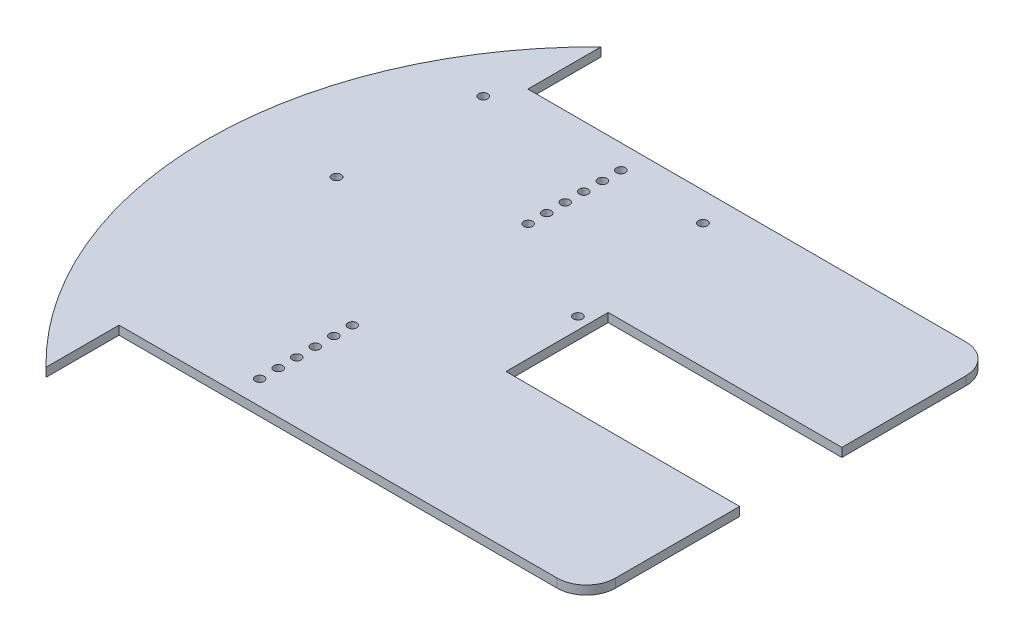
ISO-10303-21;
HEADER;
FILE_DESCRIPTION(('STEP AP214'),'2;1');
FILE_NAME('part.step','',(''),(''),'','','');
FILE_SCHEMA(('AUTOMOTIVE_DESIGN { 1 0 10303 214 1 1 1 1 }'));
ENDSEC;
DATA;
#1=APPLICATION_CONTEXT('core data for automotive mechanical design processes');
#2=APPLICATION_PROTOCOL_DEFINITION('international standard','automotive_design',2000,#1);
#3=PRODUCT_CONTEXT('',#1,'mechanical');
#4=PRODUCT('Part','Part','',(#3));
#5=PRODUCT_RELATED_PRODUCT_CATEGORY('part','',(#4));
#6=PRODUCT_DEFINITION_FORMATION('','',#4);
#7=PRODUCT_DEFINITION_CONTEXT('part definition',#1,'design');
#8=PRODUCT_DEFINITION('design','',#6,#7);
#9=PRODUCT_DEFINITION_SHAPE('','',#8);
#10=(LENGTH_UNIT() NAMED_UNIT(*) SI_UNIT(.MILLI.,.METRE.));
#11=(NAMED_UNIT(*) PLANE_ANGLE_UNIT() SI_UNIT($,.RADIAN.));
#12=(NAMED_UNIT(*) SI_UNIT($,.STERADIAN.) SOLID_ANGLE_UNIT());
#13=UNCERTAINTY_MEASURE_WITH_UNIT(LENGTH_MEASURE(1.E-05),#10,'distance_accuracy_value','');
#14=(GEOMETRIC_REPRESENTATION_CONTEXT(3) GLOBAL_UNCERTAINTY_ASSIGNED_CONTEXT((#13)) GLOBAL_UNIT_ASSIGNED_CONTEXT((#10,
#11,#12)) REPRESENTATION_CONTEXT('',''));
#15=CARTESIAN_POINT('',(0.,0.,0.));
#16=DIRECTION('',(0.,0.,1.));
#17=DIRECTION('',(1.,0.,0.));
#18=AXIS2_PLACEMENT_3D('',#15,#16,#17);
#19=CARTESIAN_POINT('',(200.301843205436,0.,-35.));
#20=DIRECTION('',(1.,0.,0.));
#21=DIRECTION('',(0.,0.,-1.));
#22=AXIS2_PLACEMENT_3D('',#19,#20,#21);
#23=PLANE('',#22);
#24=DIRECTION('',(0.,1.,0.));
#25=VECTOR('',#24,1.);
#26=CARTESIAN_POINT('',(200.301843205436,-2.,-112.5));
#27=LINE('',#26,#25);
#28=CARTESIAN_POINT('',(200.301843205436,0.,-112.5));
#29=VERTEX_POINT('',#28);
#30=CARTESIAN_POINT('',(200.301843205436,3.,-112.5));
#31=VERTEX_POINT('',#30);
#32=EDGE_CURVE('E491',#29,#31,#27,.T.);
#33=ORIENTED_EDGE('',*,*,#32,.F.);
#34=DIRECTION('',(0.,0.,-1.));
#35=VECTOR('',#34,1.);
#36=CARTESIAN_POINT('',(200.301843205436,0.,-35.));
#37=LINE('',#36,#35);
#38=CARTESIAN_POINT('',(200.301843205436,0.,-155.));
#39=VERTEX_POINT('',#38);
#40=EDGE_CURVE('E576',#29,#39,#37,.T.);
#41=ORIENTED_EDGE('',*,*,#40,.T.);
#42=DIRECTION('',(0.,1.,0.));
#43=VECTOR('',#42,1.);
#44=CARTESIAN_POINT('',(200.301843205436,0.,-155.));
#45=LINE('',#44,#43);
#46=CARTESIAN_POINT('',(200.301843205436,3.,-155.));
#47=VERTEX_POINT('',#46);
#48=EDGE_CURVE('E178',#39,#47,#45,.T.);
#49=ORIENTED_EDGE('',*,*,#48,.T.);
#50=DIRECTION('',(0.,0.,-1.));
#51=VECTOR('',#50,1.);
#52=CARTESIAN_POINT('',(200.301843205436,3.,-35.));
#53=LINE('',#52,#51);
#54=EDGE_CURVE('E152',#31,#47,#53,.T.);
#55=ORIENTED_EDGE('',*,*,#54,.F.);
#56=EDGE_LOOP('',(#33,#41,#49,#55));
#57=FACE_BOUND('',#56,.T.);
#58=ADVANCED_FACE('F38',(#57),#23,.T.);
#59=CARTESIAN_POINT('',(190.301843205435,0.,-35.));
#60=DIRECTION('',(0.,1.,0.));
#61=DIRECTION('',(0.,0.,1.));
#62=AXIS2_PLACEMENT_3D('',#59,#60,#61);
#63=CYLINDRICAL_SURFACE('',#62,10.);
#64=CARTESIAN_POINT('',(190.301843205435,3.,-35.));
#65=DIRECTION('',(0.,1.,0.));
#66=DIRECTION('',(0.,0.,1.));
#67=AXIS2_PLACEMENT_3D('',#64,#65,#66);
#68=CIRCLE('',#67,10.);
#69=CARTESIAN_POINT('',(190.301843205435,3.,-25.));
#70=VERTEX_POINT('',#69);
#71=CARTESIAN_POINT('',(200.301843205436,3.,-35.));
#72=VERTEX_POINT('',#71);
#73=EDGE_CURVE('E149',#70,#72,#68,.T.);
#74=ORIENTED_EDGE('',*,*,#73,.F.);
#75=DIRECTION('',(0.,1.,0.));
#76=VECTOR('',#75,1.);
#77=CARTESIAN_POINT('',(190.301843205435,0.,-25.));
#78=LINE('',#77,#76);
#79=CARTESIAN_POINT('',(190.301843205435,0.,-25.));
#80=VERTEX_POINT('',#79);
#81=EDGE_CURVE('E11',#80,#70,#78,.T.);
#82=ORIENTED_EDGE('',*,*,#81,.F.);
#83=CARTESIAN_POINT('',(190.301843205435,0.,-35.));
#84=DIRECTION('',(0.,1.,0.));
#85=DIRECTION('',(0.,0.,1.));
#86=AXIS2_PLACEMENT_3D('',#83,#84,#85);
#87=CIRCLE('',#86,10.);
#88=CARTESIAN_POINT('',(200.301843205436,0.,-35.));
#89=VERTEX_POINT('',#88);
#90=EDGE_CURVE('E171',#80,#89,#87,.T.);
#91=ORIENTED_EDGE('',*,*,#90,.T.);
#92=DIRECTION('',(0.,1.,0.));
#93=VECTOR('',#92,1.);
#94=CARTESIAN_POINT('',(200.301843205436,0.,-35.));
#95=LINE('',#94,#93);
#96=EDGE_CURVE('E42',#89,#72,#95,.T.);
#97=ORIENTED_EDGE('',*,*,#96,.T.);
#98=EDGE_LOOP('',(#74,#82,#91,#97));
#99=FACE_BOUND('',#98,.T.);
#100=ADVANCED_FACE('F40',(#99),#63,.T.);
#101=CARTESIAN_POINT('',(40.3018432054357,0.,-25.));
#102=DIRECTION('',(0.,0.,1.));
#103=DIRECTION('',(1.,0.,0.));
#104=AXIS2_PLACEMENT_3D('',#101,#102,#103);
#105=PLANE('',#104);
#106=DIRECTION('',(1.,0.,0.));
#107=VECTOR('',#106,1.);
#108=CARTESIAN_POINT('',(40.3018432054357,3.,-25.));
#109=LINE('',#108,#107);
#110=CARTESIAN_POINT('',(40.3018432054357,3.,-25.));
#111=VERTEX_POINT('',#110);
#112=EDGE_CURVE('E169',#111,#70,#109,.T.);
#113=ORIENTED_EDGE('',*,*,#112,.F.);
#114=DIRECTION('',(0.,1.,0.));
#115=VECTOR('',#114,1.);
#116=CARTESIAN_POINT('',(40.3018432054357,0.,-25.));
#117=LINE('',#116,#115);
#118=CARTESIAN_POINT('',(40.3018432054357,0.,-25.));
#119=VERTEX_POINT('',#118);
#120=EDGE_CURVE('E47',#119,#111,#117,.T.);
#121=ORIENTED_EDGE('',*,*,#120,.F.);
#122=DIRECTION('',(1.,0.,0.));
#123=VECTOR('',#122,1.);
#124=CARTESIAN_POINT('',(40.3018432054357,0.,-25.));
#125=LINE('',#124,#123);
#126=EDGE_CURVE('E139',#119,#80,#125,.T.);
#127=ORIENTED_EDGE('',*,*,#126,.T.);
#128=ORIENTED_EDGE('',*,*,#81,.T.);
#129=EDGE_LOOP('',(#113,#121,#127,#128));
#130=FACE_BOUND('',#129,.T.);
#131=ADVANCED_FACE('F194',(#130),#105,.T.);
#132=CARTESIAN_POINT('',(40.3018432054357,0.,0.));
#133=DIRECTION('',(1.,0.,0.));
#134=DIRECTION('',(0.,0.,-1.));
#135=AXIS2_PLACEMENT_3D('',#132,#133,#134);
#136=PLANE('',#135);
#137=DIRECTION('',(0.,0.,-1.));
#138=VECTOR('',#137,1.);
#139=CARTESIAN_POINT('',(40.3018432054357,3.,0.));
#140=LINE('',#139,#138);
#141=CARTESIAN_POINT('',(40.3018432054356,3.,0.));
#142=VERTEX_POINT('',#141);
#143=EDGE_CURVE('E125',#142,#111,#140,.T.);
#144=ORIENTED_EDGE('',*,*,#143,.F.);
#145=DIRECTION('',(0.,1.,0.));
#146=VECTOR('',#145,1.);
#147=CARTESIAN_POINT('',(40.3018432054356,0.,0.));
#148=LINE('',#147,#146);
#149=CARTESIAN_POINT('',(40.3018432054356,0.,0.));
#150=VERTEX_POINT('',#149);
#151=EDGE_CURVE('E119',#150,#142,#148,.T.);
#152=ORIENTED_EDGE('',*,*,#151,.F.);
#153=DIRECTION('',(0.,0.,-1.));
#154=VECTOR('',#153,1.);
#155=CARTESIAN_POINT('',(40.3018432054357,0.,0.));
#156=LINE('',#155,#154);
#157=EDGE_CURVE('E122',#150,#119,#156,.T.);
#158=ORIENTED_EDGE('',*,*,#157,.T.);
#159=ORIENTED_EDGE('',*,*,#120,.T.);
#160=EDGE_LOOP('',(#144,#152,#158,#159));
#161=FACE_BOUND('',#160,.T.);
#162=ADVANCED_FACE('F121',(#161),#136,.T.);
#163=CARTESIAN_POINT('',(133.114343205436,0.,-95.));
#164=DIRECTION('',(0.,1.,0.));
#165=DIRECTION('',(0.,0.,1.));
#166=AXIS2_PLACEMENT_3D('',#163,#164,#165);
#167=CYLINDRICAL_SURFACE('',#166,132.8125);
#168=CARTESIAN_POINT('',(133.114343205436,3.,-95.));
#169=DIRECTION('',(0.,1.,0.));
#170=DIRECTION('',(0.,0.,1.));
#171=AXIS2_PLACEMENT_3D('',#168,#169,#170);
#172=CIRCLE('',#171,132.8125);
#173=CARTESIAN_POINT('',(40.3018432054356,3.,-190.));
#174=VERTEX_POINT('',#173);
#175=EDGE_CURVE('E166',#174,#142,#172,.T.);
#176=ORIENTED_EDGE('',*,*,#175,.F.);
#177=DIRECTION('',(0.,1.,0.));
#178=VECTOR('',#177,1.);
#179=CARTESIAN_POINT('',(40.3018432054356,0.,-190.));
#180=LINE('',#179,#178);
#181=CARTESIAN_POINT('',(40.3018432054356,0.,-190.));
#182=VERTEX_POINT('',#181);
#183=EDGE_CURVE('E130',#182,#174,#180,.T.);
#184=ORIENTED_EDGE('',*,*,#183,.F.);
#185=CARTESIAN_POINT('',(133.114343205436,0.,-95.));
#186=DIRECTION('',(0.,1.,0.));
#187=DIRECTION('',(0.,0.,1.));
#188=AXIS2_PLACEMENT_3D('',#185,#186,#187);
#189=CIRCLE('',#188,132.8125);
#190=EDGE_CURVE('E137',#182,#150,#189,.T.);
#191=ORIENTED_EDGE('',*,*,#190,.T.);
#192=ORIENTED_EDGE('',*,*,#151,.T.);
#193=EDGE_LOOP('',(#176,#184,#191,#192));
#194=FACE_BOUND('',#193,.T.);
#195=ADVANCED_FACE('F141',(#194),#167,.T.);
#196=CARTESIAN_POINT('',(40.3018432054357,0.,-165.));
#197=DIRECTION('',(1.,0.,0.));
#198=DIRECTION('',(0.,0.,-1.));
#199=AXIS2_PLACEMENT_3D('',#196,#197,#198);
#200=PLANE('',#199);
#201=DIRECTION('',(0.,0.,-1.));
#202=VECTOR('',#201,1.);
#203=CARTESIAN_POINT('',(40.3018432054357,3.,-165.));
#204=LINE('',#203,#202);
#205=CARTESIAN_POINT('',(40.3018432054357,3.,-165.));
#206=VERTEX_POINT('',#205);
#207=EDGE_CURVE('E163',#206,#174,#204,.T.);
#208=ORIENTED_EDGE('',*,*,#207,.F.);
#209=DIRECTION('',(0.,1.,0.));
#210=VECTOR('',#209,1.);
#211=CARTESIAN_POINT('',(40.3018432054357,0.,-165.));
#212=LINE('',#211,#210);
#213=CARTESIAN_POINT('',(40.3018432054357,0.,-165.));
#214=VERTEX_POINT('',#213);
#215=EDGE_CURVE('E175',#214,#206,#212,.T.);
#216=ORIENTED_EDGE('',*,*,#215,.F.);
#217=DIRECTION('',(0.,0.,-1.));
#218=VECTOR('',#217,1.);
#219=CARTESIAN_POINT('',(40.3018432054357,0.,-165.));
#220=LINE('',#219,#218);
#221=EDGE_CURVE('E142',#214,#182,#220,.T.);
#222=ORIENTED_EDGE('',*,*,#221,.T.);
#223=ORIENTED_EDGE('',*,*,#183,.T.);
#224=EDGE_LOOP('',(#208,#216,#222,#223));
#225=FACE_BOUND('',#224,.T.);
#226=ADVANCED_FACE('F221',(#225),#200,.T.);
#227=CARTESIAN_POINT('',(190.301843205435,0.,-165.));
#228=DIRECTION('',(0.,0.,-1.));
#229=DIRECTION('',(-1.,0.,0.));
#230=AXIS2_PLACEMENT_3D('',#227,#228,#229);
#231=PLANE('',#230);
#232=DIRECTION('',(-1.,0.,0.));
#233=VECTOR('',#232,1.);
#234=CARTESIAN_POINT('',(190.301843205435,3.,-165.));
#235=LINE('',#234,#233);
#236=CARTESIAN_POINT('',(190.301843205435,3.,-165.));
#237=VERTEX_POINT('',#236);
#238=EDGE_CURVE('E160',#237,#206,#235,.T.);
#239=ORIENTED_EDGE('',*,*,#238,.F.);
#240=DIRECTION('',(0.,1.,0.));
#241=VECTOR('',#240,1.);
#242=CARTESIAN_POINT('',(190.301843205435,0.,-165.));
#243=LINE('',#242,#241);
#244=CARTESIAN_POINT('',(190.301843205435,0.,-165.));
#245=VERTEX_POINT('',#244);
#246=EDGE_CURVE('E177',#245,#237,#243,.T.);
#247=ORIENTED_EDGE('',*,*,#246,.F.);
#248=DIRECTION('',(-1.,0.,0.));
#249=VECTOR('',#248,1.);
#250=CARTESIAN_POINT('',(190.301843205435,0.,-165.));
#251=LINE('',#250,#249);
#252=EDGE_CURVE('E144',#245,#214,#251,.T.);
#253=ORIENTED_EDGE('',*,*,#252,.T.);
#254=ORIENTED_EDGE('',*,*,#215,.T.);
#255=EDGE_LOOP('',(#239,#247,#253,#254));
#256=FACE_BOUND('',#255,.T.);
#257=ADVANCED_FACE('F216',(#256),#231,.T.);
#258=CARTESIAN_POINT('',(190.301843205435,0.,-155.));
#259=DIRECTION('',(0.,1.,0.));
#260=DIRECTION('',(0.,0.,1.));
#261=AXIS2_PLACEMENT_3D('',#258,#259,#260);
#262=CYLINDRICAL_SURFACE('',#261,10.);
#263=CARTESIAN_POINT('',(190.301843205435,3.,-155.));
#264=DIRECTION('',(0.,1.,0.));
#265=DIRECTION('',(0.,0.,1.));
#266=AXIS2_PLACEMENT_3D('',#263,#264,#265);
#267=CIRCLE('',#266,10.);
#268=EDGE_CURVE('E157',#47,#237,#267,.T.);
#269=ORIENTED_EDGE('',*,*,#268,.F.);
#270=ORIENTED_EDGE('',*,*,#48,.F.);
#271=CARTESIAN_POINT('',(190.301843205435,0.,-155.));
#272=DIRECTION('',(0.,1.,0.));
#273=DIRECTION('',(0.,0.,1.));
#274=AXIS2_PLACEMENT_3D('',#271,#272,#273);
#275=CIRCLE('',#274,10.);
#276=EDGE_CURVE('E579',#39,#245,#275,.T.);
#277=ORIENTED_EDGE('',*,*,#276,.T.);
#278=ORIENTED_EDGE('',*,*,#246,.T.);
#279=EDGE_LOOP('',(#269,#270,#277,#278));
#280=FACE_BOUND('',#279,.T.);
#281=ADVANCED_FACE('F209',(#280),#262,.T.);
#282=DIRECTION('',(0.,1.,0.));
#283=VECTOR('',#282,1.);
#284=CARTESIAN_POINT('',(200.301843205436,-2.,-77.5));
#285=LINE('',#284,#283);
#286=CARTESIAN_POINT('',(200.301843205436,0.,-77.5));
#287=VERTEX_POINT('',#286);
#288=CARTESIAN_POINT('',(200.301843205436,3.,-77.5));
#289=VERTEX_POINT('',#288);
#290=EDGE_CURVE('E188',#287,#289,#285,.T.);
#291=ORIENTED_EDGE('',*,*,#290,.T.);
#292=EDGE_CURVE('E154',#72,#289,#53,.T.);
#293=ORIENTED_EDGE('',*,*,#292,.F.);
#294=ORIENTED_EDGE('',*,*,#96,.F.);
#295=EDGE_CURVE('E577',#89,#287,#37,.T.);
#296=ORIENTED_EDGE('',*,*,#295,.T.);
#297=EDGE_LOOP('',(#291,#293,#294,#296));
#298=FACE_BOUND('',#297,.T.);
#299=ADVANCED_FACE('F185',(#298),#23,.T.);
#300=CARTESIAN_POINT('',(190.301843205435,0.,-35.));
#301=DIRECTION('',(0.,1.,0.));
#302=DIRECTION('',(0.,0.,1.));
#303=AXIS2_PLACEMENT_3D('',#300,#301,#302);
#304=PLANE('',#303);
#305=CARTESIAN_POINT('',(116.269271836724,0.,-106.15));
#306=DIRECTION('',(0.,1.,0.));
#307=DIRECTION('',(0.,0.,1.));
#308=AXIS2_PLACEMENT_3D('',#305,#306,#307);
#309=CIRCLE('',#308,1.55000000000001);
#310=CARTESIAN_POINT('',(116.269271836724,0.,-104.6));
#311=VERTEX_POINT('',#310);
#312=EDGE_CURVE('E464',#311,#311,#309,.T.);
#313=ORIENTED_EDGE('',*,*,#312,.T.);
#314=EDGE_LOOP('',(#313));
#315=FACE_BOUND('',#314,.T.);
#316=CARTESIAN_POINT('',(110.019271836724,0.,-155.2));
#317=DIRECTION('',(0.,1.,0.));
#318=DIRECTION('',(0.,0.,1.));
#319=AXIS2_PLACEMENT_3D('',#316,#317,#318);
#320=CIRCLE('',#319,1.55000000000001);
#321=CARTESIAN_POINT('',(110.019271836724,0.,-153.65));
#322=VERTEX_POINT('',#321);
#323=EDGE_CURVE('E667',#322,#322,#320,.T.);
#324=ORIENTED_EDGE('',*,*,#323,.T.);
#325=EDGE_LOOP('',(#324));
#326=FACE_BOUND('',#325,.T.);
#327=CARTESIAN_POINT('',(33.6192718367243,0.,-106.15));
#328=DIRECTION('',(0.,1.,0.));
#329=DIRECTION('',(0.,0.,1.));
#330=AXIS2_PLACEMENT_3D('',#327,#328,#329);
#331=CIRCLE('',#330,1.55000000000001);
#332=CARTESIAN_POINT('',(33.6192718367243,0.,-104.6));
#333=VERTEX_POINT('',#332);
#334=EDGE_CURVE('E479',#333,#333,#331,.T.);
#335=ORIENTED_EDGE('',*,*,#334,.T.);
#336=EDGE_LOOP('',(#335));
#337=FACE_BOUND('',#336,.T.);
#338=CARTESIAN_POINT('',(34.8192718367243,0.,-155.2));
#339=DIRECTION('',(0.,1.,0.));
#340=DIRECTION('',(0.,0.,1.));
#341=AXIS2_PLACEMENT_3D('',#338,#339,#340);
#342=CIRCLE('',#341,1.54999999999999);
#343=CARTESIAN_POINT('',(34.8192718367243,0.,-153.65));
#344=VERTEX_POINT('',#343);
#345=EDGE_CURVE('E473',#344,#344,#342,.T.);
#346=ORIENTED_EDGE('',*,*,#345,.T.);
#347=EDGE_LOOP('',(#346));
#348=FACE_BOUND('',#347,.T.);
#349=CARTESIAN_POINT('',(80.3018432054357,0.,-39.51));
#350=DIRECTION('',(0.,1.,0.));
#351=DIRECTION('',(0.,0.,-1.));
#352=AXIS2_PLACEMENT_3D('',#349,#350,#351);
#353=CIRCLE('',#352,1.525);
#354=CARTESIAN_POINT('',(80.3018432054357,0.,-41.035));
#355=VERTEX_POINT('',#354);
#356=EDGE_CURVE('E505',#355,#355,#353,.T.);
#357=ORIENTED_EDGE('',*,*,#356,.T.);
#358=EDGE_LOOP('',(#357));
#359=FACE_BOUND('',#358,.T.);
#360=CARTESIAN_POINT('',(80.3018432054357,0.,-45.86));
#361=DIRECTION('',(0.,1.,0.));
#362=DIRECTION('',(0.,0.,-1.));
#363=AXIS2_PLACEMENT_3D('',#360,#361,#362);
#364=CIRCLE('',#363,1.525);
#365=CARTESIAN_POINT('',(80.3018432054357,0.,-47.385));
#366=VERTEX_POINT('',#365);
#367=EDGE_CURVE('E511',#366,#366,#364,.T.);
#368=ORIENTED_EDGE('',*,*,#367,.T.);
#369=EDGE_LOOP('',(#368));
#370=FACE_BOUND('',#369,.T.);
#371=CARTESIAN_POINT('',(80.3018432054357,0.,-52.21));
#372=DIRECTION('',(0.,1.,0.));
#373=DIRECTION('',(0.,0.,-1.));
#374=AXIS2_PLACEMENT_3D('',#371,#372,#373);
#375=CIRCLE('',#374,1.525);
#376=CARTESIAN_POINT('',(80.3018432054357,0.,-53.735));
#377=VERTEX_POINT('',#376);
#378=EDGE_CURVE('E517',#377,#377,#375,.T.);
#379=ORIENTED_EDGE('',*,*,#378,.T.);
#380=EDGE_LOOP('',(#379));
#381=FACE_BOUND('',#380,.T.);
#382=CARTESIAN_POINT('',(80.3018432054357,0.,-58.56));
#383=DIRECTION('',(0.,1.,0.));
#384=DIRECTION('',(0.,0.,-1.));
#385=AXIS2_PLACEMENT_3D('',#382,#383,#384);
#386=CIRCLE('',#385,1.525);
#387=CARTESIAN_POINT('',(80.3018432054357,0.,-60.085));
#388=VERTEX_POINT('',#387);
#389=EDGE_CURVE('E523',#388,#388,#386,.T.);
#390=ORIENTED_EDGE('',*,*,#389,.T.);
#391=EDGE_LOOP('',(#390));
#392=FACE_BOUND('',#391,.T.);
#393=CARTESIAN_POINT('',(80.3018432054357,0.,-144.14));
#394=DIRECTION('',(0.,1.,0.));
#395=DIRECTION('',(0.,0.,-1.));
#396=AXIS2_PLACEMENT_3D('',#393,#394,#395);
#397=CIRCLE('',#396,1.525);
#398=CARTESIAN_POINT('',(80.3018432054357,0.,-145.665));
#399=VERTEX_POINT('',#398);
#400=EDGE_CURVE('E529',#399,#399,#397,.T.);
#401=ORIENTED_EDGE('',*,*,#400,.T.);
#402=EDGE_LOOP('',(#401));
#403=FACE_BOUND('',#402,.T.);
#404=CARTESIAN_POINT('',(80.3018432054357,0.,-150.49));
#405=DIRECTION('',(0.,1.,0.));
#406=DIRECTION('',(0.,0.,-1.));
#407=AXIS2_PLACEMENT_3D('',#404,#405,#406);
#408=CIRCLE('',#407,1.525);
#409=CARTESIAN_POINT('',(80.3018432054357,0.,-152.015));
#410=VERTEX_POINT('',#409);
#411=EDGE_CURVE('E535',#410,#410,#408,.T.);
#412=ORIENTED_EDGE('',*,*,#411,.T.);
#413=EDGE_LOOP('',(#412));
#414=FACE_BOUND('',#413,.T.);
#415=CARTESIAN_POINT('',(80.3018432054357,0.,-156.84));
#416=DIRECTION('',(0.,1.,0.));
#417=DIRECTION('',(0.,0.,-1.));
#418=AXIS2_PLACEMENT_3D('',#415,#416,#417);
#419=CIRCLE('',#418,1.525);
#420=CARTESIAN_POINT('',(80.3018432054357,0.,-158.365));
#421=VERTEX_POINT('',#420);
#422=EDGE_CURVE('E541',#421,#421,#419,.T.);
#423=ORIENTED_EDGE('',*,*,#422,.T.);
#424=EDGE_LOOP('',(#423));
#425=FACE_BOUND('',#424,.T.);
#426=CARTESIAN_POINT('',(80.3018432054357,0.,-64.91));
#427=DIRECTION('',(0.,1.,0.));
#428=DIRECTION('',(0.,0.,-1.));
#429=AXIS2_PLACEMENT_3D('',#426,#427,#428);
#430=CIRCLE('',#429,1.525);
#431=CARTESIAN_POINT('',(80.3018432054357,0.,-66.435));
#432=VERTEX_POINT('',#431);
#433=EDGE_CURVE('E547',#432,#432,#430,.T.);
#434=ORIENTED_EDGE('',*,*,#433,.T.);
#435=EDGE_LOOP('',(#434));
#436=FACE_BOUND('',#435,.T.);
#437=CARTESIAN_POINT('',(80.3018432054357,0.,-137.79));
#438=DIRECTION('',(0.,1.,0.));
#439=DIRECTION('',(0.,0.,-1.));
#440=AXIS2_PLACEMENT_3D('',#437,#438,#439);
#441=CIRCLE('',#440,1.525);
#442=CARTESIAN_POINT('',(80.3018432054357,0.,-139.315));
#443=VERTEX_POINT('',#442);
#444=EDGE_CURVE('E553',#443,#443,#441,.T.);
#445=ORIENTED_EDGE('',*,*,#444,.T.);
#446=EDGE_LOOP('',(#445));
#447=FACE_BOUND('',#446,.T.);
#448=CARTESIAN_POINT('',(80.3018432054357,0.,-131.44));
#449=DIRECTION('',(0.,1.,0.));
#450=DIRECTION('',(0.,0.,-1.));
#451=AXIS2_PLACEMENT_3D('',#448,#449,#450);
#452=CIRCLE('',#451,1.525);
#453=CARTESIAN_POINT('',(80.3018432054357,0.,-132.965));
#454=VERTEX_POINT('',#453);
#455=EDGE_CURVE('E559',#454,#454,#452,.T.);
#456=ORIENTED_EDGE('',*,*,#455,.T.);
#457=EDGE_LOOP('',(#456));
#458=FACE_BOUND('',#457,.T.);
#459=CARTESIAN_POINT('',(80.3018432054357,0.,-125.09));
#460=DIRECTION('',(0.,1.,0.));
#461=DIRECTION('',(0.,0.,-1.));
#462=AXIS2_PLACEMENT_3D('',#459,#460,#461);
#463=CIRCLE('',#462,1.525);
#464=CARTESIAN_POINT('',(80.3018432054357,0.,-126.615));
#465=VERTEX_POINT('',#464);
#466=EDGE_CURVE('E565',#465,#465,#463,.T.);
#467=ORIENTED_EDGE('',*,*,#466,.T.);
#468=EDGE_LOOP('',(#467));
#469=FACE_BOUND('',#468,.T.);
#470=CARTESIAN_POINT('',(80.3018432054357,0.,-33.16));
#471=DIRECTION('',(0.,1.,0.));
#472=DIRECTION('',(0.,0.,-1.));
#473=AXIS2_PLACEMENT_3D('',#470,#471,#472);
#474=CIRCLE('',#473,1.525);
#475=CARTESIAN_POINT('',(80.3018432054357,0.,-34.685));
#476=VERTEX_POINT('',#475);
#477=EDGE_CURVE('E153',#476,#476,#474,.T.);
#478=ORIENTED_EDGE('',*,*,#477,.T.);
#479=EDGE_LOOP('',(#478));
#480=FACE_BOUND('',#479,.T.);
#481=ORIENTED_EDGE('',*,*,#40,.F.);
#482=DIRECTION('',(-1.,0.,0.));
#483=VECTOR('',#482,1.);
#484=CARTESIAN_POINT('',(190.301843205435,0.,-112.5));
#485=LINE('',#484,#483);
#486=CARTESIAN_POINT('',(120.301843205436,0.,-112.5));
#487=VERTEX_POINT('',#486);
#488=EDGE_CURVE('E498',#29,#487,#485,.T.);
#489=ORIENTED_EDGE('',*,*,#488,.T.);
#490=DIRECTION('',(0.,0.,1.));
#491=VECTOR('',#490,1.);
#492=CARTESIAN_POINT('',(120.301843205436,0.,-35.));
#493=LINE('',#492,#491);
#494=CARTESIAN_POINT('',(120.301843205436,0.,-77.5));
#495=VERTEX_POINT('',#494);
#496=EDGE_CURVE('E501',#487,#495,#493,.T.);
#497=ORIENTED_EDGE('',*,*,#496,.T.);
#498=DIRECTION('',(1.,0.,0.));
#499=VECTOR('',#498,1.);
#500=CARTESIAN_POINT('',(190.301843205435,0.,-77.5));
#501=LINE('',#500,#499);
#502=EDGE_CURVE('E490',#495,#287,#501,.T.);
#503=ORIENTED_EDGE('',*,*,#502,.T.);
#504=ORIENTED_EDGE('',*,*,#295,.F.);
#505=ORIENTED_EDGE('',*,*,#90,.F.);
#506=ORIENTED_EDGE('',*,*,#126,.F.);
#507=ORIENTED_EDGE('',*,*,#157,.F.);
#508=ORIENTED_EDGE('',*,*,#190,.F.);
#509=ORIENTED_EDGE('',*,*,#221,.F.);
#510=ORIENTED_EDGE('',*,*,#252,.F.);
#511=ORIENTED_EDGE('',*,*,#276,.F.);
#512=EDGE_LOOP('',(#481,#489,#497,#503,#504,#505,#506,#507,#508,#509,#510,#511));
#513=FACE_BOUND('',#512,.T.);
#514=ADVANCED_FACE('F135',(#315,#326,#337,#348,#359,#370,#381,#392,#403,#414,#425,#436,#447,
#458,#469,#480,#513),#304,.F.);
#515=CARTESIAN_POINT('',(190.301843205435,3.,-35.));
#516=DIRECTION('',(0.,1.,0.));
#517=DIRECTION('',(0.,0.,1.));
#518=AXIS2_PLACEMENT_3D('',#515,#516,#517);
#519=PLANE('',#518);
#520=CARTESIAN_POINT('',(116.269271836724,3.,-106.15));
#521=DIRECTION('',(0.,1.,0.));
#522=DIRECTION('',(0.,0.,1.));
#523=AXIS2_PLACEMENT_3D('',#520,#521,#522);
#524=CIRCLE('',#523,1.55000000000001);
#525=CARTESIAN_POINT('',(116.269271836724,3.,-104.6));
#526=VERTEX_POINT('',#525);
#527=EDGE_CURVE('E467',#526,#526,#524,.T.);
#528=ORIENTED_EDGE('',*,*,#527,.F.);
#529=EDGE_LOOP('',(#528));
#530=FACE_BOUND('',#529,.T.);
#531=CARTESIAN_POINT('',(110.019271836724,3.,-155.2));
#532=DIRECTION('',(0.,1.,0.));
#533=DIRECTION('',(0.,0.,1.));
#534=AXIS2_PLACEMENT_3D('',#531,#532,#533);
#535=CIRCLE('',#534,1.55000000000001);
#536=CARTESIAN_POINT('',(110.019271836724,3.,-153.65));
#537=VERTEX_POINT('',#536);
#538=EDGE_CURVE('E469',#537,#537,#535,.T.);
#539=ORIENTED_EDGE('',*,*,#538,.F.);
#540=EDGE_LOOP('',(#539));
#541=FACE_BOUND('',#540,.T.);
#542=CARTESIAN_POINT('',(33.6192718367243,3.,-106.15));
#543=DIRECTION('',(0.,1.,0.));
#544=DIRECTION('',(0.,0.,1.));
#545=AXIS2_PLACEMENT_3D('',#542,#543,#544);
#546=CIRCLE('',#545,1.55000000000001);
#547=CARTESIAN_POINT('',(33.6192718367243,3.,-104.6));
#548=VERTEX_POINT('',#547);
#549=EDGE_CURVE('E662',#548,#548,#546,.T.);
#550=ORIENTED_EDGE('',*,*,#549,.F.);
#551=EDGE_LOOP('',(#550));
#552=FACE_BOUND('',#551,.T.);
#553=CARTESIAN_POINT('',(34.8192718367243,3.,-155.2));
#554=DIRECTION('',(0.,1.,0.));
#555=DIRECTION('',(0.,0.,1.));
#556=AXIS2_PLACEMENT_3D('',#553,#554,#555);
#557=CIRCLE('',#556,1.54999999999999);
#558=CARTESIAN_POINT('',(34.8192718367243,3.,-153.65));
#559=VERTEX_POINT('',#558);
#560=EDGE_CURVE('E476',#559,#559,#557,.T.);
#561=ORIENTED_EDGE('',*,*,#560,.F.);
#562=EDGE_LOOP('',(#561));
#563=FACE_BOUND('',#562,.T.);
#564=DIRECTION('',(-1.,0.,0.));
#565=VECTOR('',#564,1.);
#566=CARTESIAN_POINT('',(120.301843205436,3.,-112.5));
#567=LINE('',#566,#565);
#568=CARTESIAN_POINT('',(120.301843205436,3.,-112.5));
#569=VERTEX_POINT('',#568);
#570=EDGE_CURVE('E484',#31,#569,#567,.T.);
#571=ORIENTED_EDGE('',*,*,#570,.F.);
#572=ORIENTED_EDGE('',*,*,#54,.T.);
#573=ORIENTED_EDGE('',*,*,#268,.T.);
#574=ORIENTED_EDGE('',*,*,#238,.T.);
#575=ORIENTED_EDGE('',*,*,#207,.T.);
#576=ORIENTED_EDGE('',*,*,#175,.T.);
#577=ORIENTED_EDGE('',*,*,#143,.T.);
#578=ORIENTED_EDGE('',*,*,#112,.T.);
#579=ORIENTED_EDGE('',*,*,#73,.T.);
#580=ORIENTED_EDGE('',*,*,#292,.T.);
#581=DIRECTION('',(1.,0.,0.));
#582=VECTOR('',#581,1.);
#583=CARTESIAN_POINT('',(120.301843205436,3.,-77.5));
#584=LINE('',#583,#582);
#585=CARTESIAN_POINT('',(120.301843205436,3.,-77.5));
#586=VERTEX_POINT('',#585);
#587=EDGE_CURVE('E481',#586,#289,#584,.T.);
#588=ORIENTED_EDGE('',*,*,#587,.F.);
#589=DIRECTION('',(0.,0.,1.));
#590=VECTOR('',#589,1.);
#591=CARTESIAN_POINT('',(120.301843205436,3.,-77.5));
#592=LINE('',#591,#590);
#593=EDGE_CURVE('E55',#569,#586,#592,.T.);
#594=ORIENTED_EDGE('',*,*,#593,.F.);
#595=EDGE_LOOP('',(#571,#572,#573,#574,#575,#576,#577,#578,#579,#580,#588,#594));
#596=FACE_BOUND('',#595,.T.);
#597=CARTESIAN_POINT('',(80.3018432054357,3.,-39.51));
#598=DIRECTION('',(0.,1.,0.));
#599=DIRECTION('',(0.,0.,-1.));
#600=AXIS2_PLACEMENT_3D('',#597,#598,#599);
#601=CIRCLE('',#600,1.525);
#602=CARTESIAN_POINT('',(80.3018432054357,3.,-41.035));
#603=VERTEX_POINT('',#602);
#604=EDGE_CURVE('E504',#603,#603,#601,.T.);
#605=ORIENTED_EDGE('',*,*,#604,.F.);
#606=EDGE_LOOP('',(#605));
#607=FACE_BOUND('',#606,.T.);
#608=CARTESIAN_POINT('',(80.3018432054357,3.,-45.86));
#609=DIRECTION('',(0.,1.,0.));
#610=DIRECTION('',(0.,0.,-1.));
#611=AXIS2_PLACEMENT_3D('',#608,#609,#610);
#612=CIRCLE('',#611,1.525);
#613=CARTESIAN_POINT('',(80.3018432054357,3.,-47.385));
#614=VERTEX_POINT('',#613);
#615=EDGE_CURVE('E508',#614,#614,#612,.T.);
#616=ORIENTED_EDGE('',*,*,#615,.F.);
#617=EDGE_LOOP('',(#616));
#618=FACE_BOUND('',#617,.T.);
#619=CARTESIAN_POINT('',(80.3018432054357,3.,-52.21));
#620=DIRECTION('',(0.,1.,0.));
#621=DIRECTION('',(0.,0.,-1.));
#622=AXIS2_PLACEMENT_3D('',#619,#620,#621);
#623=CIRCLE('',#622,1.525);
#624=CARTESIAN_POINT('',(80.3018432054357,3.,-53.735));
#625=VERTEX_POINT('',#624);
#626=EDGE_CURVE('E514',#625,#625,#623,.T.);
#627=ORIENTED_EDGE('',*,*,#626,.F.);
#628=EDGE_LOOP('',(#627));
#629=FACE_BOUND('',#628,.T.);
#630=CARTESIAN_POINT('',(80.3018432054357,3.,-58.56));
#631=DIRECTION('',(0.,1.,0.));
#632=DIRECTION('',(0.,0.,-1.));
#633=AXIS2_PLACEMENT_3D('',#630,#631,#632);
#634=CIRCLE('',#633,1.525);
#635=CARTESIAN_POINT('',(80.3018432054357,3.,-60.085));
#636=VERTEX_POINT('',#635);
#637=EDGE_CURVE('E520',#636,#636,#634,.T.);
#638=ORIENTED_EDGE('',*,*,#637,.F.);
#639=EDGE_LOOP('',(#638));
#640=FACE_BOUND('',#639,.T.);
#641=CARTESIAN_POINT('',(80.3018432054357,3.,-144.14));
#642=DIRECTION('',(0.,1.,0.));
#643=DIRECTION('',(0.,0.,-1.));
#644=AXIS2_PLACEMENT_3D('',#641,#642,#643);
#645=CIRCLE('',#644,1.525);
#646=CARTESIAN_POINT('',(80.3018432054357,3.,-145.665));
#647=VERTEX_POINT('',#646);
#648=EDGE_CURVE('E526',#647,#647,#645,.T.);
#649=ORIENTED_EDGE('',*,*,#648,.F.);
#650=EDGE_LOOP('',(#649));
#651=FACE_BOUND('',#650,.T.);
#652=CARTESIAN_POINT('',(80.3018432054357,3.,-150.49));
#653=DIRECTION('',(0.,1.,0.));
#654=DIRECTION('',(0.,0.,-1.));
#655=AXIS2_PLACEMENT_3D('',#652,#653,#654);
#656=CIRCLE('',#655,1.525);
#657=CARTESIAN_POINT('',(80.3018432054357,3.,-152.015));
#658=VERTEX_POINT('',#657);
#659=EDGE_CURVE('E532',#658,#658,#656,.T.);
#660=ORIENTED_EDGE('',*,*,#659,.F.);
#661=EDGE_LOOP('',(#660));
#662=FACE_BOUND('',#661,.T.);
#663=CARTESIAN_POINT('',(80.3018432054357,3.,-156.84));
#664=DIRECTION('',(0.,1.,0.));
#665=DIRECTION('',(0.,0.,-1.));
#666=AXIS2_PLACEMENT_3D('',#663,#664,#665);
#667=CIRCLE('',#666,1.525);
#668=CARTESIAN_POINT('',(80.3018432054357,3.,-158.365));
#669=VERTEX_POINT('',#668);
#670=EDGE_CURVE('E538',#669,#669,#667,.T.);
#671=ORIENTED_EDGE('',*,*,#670,.F.);
#672=EDGE_LOOP('',(#671));
#673=FACE_BOUND('',#672,.T.);
#674=CARTESIAN_POINT('',(80.3018432054357,3.,-64.91));
#675=DIRECTION('',(0.,1.,0.));
#676=DIRECTION('',(0.,0.,-1.));
#677=AXIS2_PLACEMENT_3D('',#674,#675,#676);
#678=CIRCLE('',#677,1.525);
#679=CARTESIAN_POINT('',(80.3018432054357,3.,-66.435));
#680=VERTEX_POINT('',#679);
#681=EDGE_CURVE('E544',#680,#680,#678,.T.);
#682=ORIENTED_EDGE('',*,*,#681,.F.);
#683=EDGE_LOOP('',(#682));
#684=FACE_BOUND('',#683,.T.);
#685=CARTESIAN_POINT('',(80.3018432054357,3.,-137.79));
#686=DIRECTION('',(0.,1.,0.));
#687=DIRECTION('',(0.,0.,-1.));
#688=AXIS2_PLACEMENT_3D('',#685,#686,#687);
#689=CIRCLE('',#688,1.525);
#690=CARTESIAN_POINT('',(80.3018432054357,3.,-139.315));
#691=VERTEX_POINT('',#690);
#692=EDGE_CURVE('E550',#691,#691,#689,.T.);
#693=ORIENTED_EDGE('',*,*,#692,.F.);
#694=EDGE_LOOP('',(#693));
#695=FACE_BOUND('',#694,.T.);
#696=CARTESIAN_POINT('',(80.3018432054357,3.,-131.44));
#697=DIRECTION('',(0.,1.,0.));
#698=DIRECTION('',(0.,0.,-1.));
#699=AXIS2_PLACEMENT_3D('',#696,#697,#698);
#700=CIRCLE('',#699,1.525);
#701=CARTESIAN_POINT('',(80.3018432054357,3.,-132.965));
#702=VERTEX_POINT('',#701);
#703=EDGE_CURVE('E556',#702,#702,#700,.T.);
#704=ORIENTED_EDGE('',*,*,#703,.F.);
#705=EDGE_LOOP('',(#704));
#706=FACE_BOUND('',#705,.T.);
#707=CARTESIAN_POINT('',(80.3018432054357,3.,-125.09));
#708=DIRECTION('',(0.,1.,0.));
#709=DIRECTION('',(0.,0.,-1.));
#710=AXIS2_PLACEMENT_3D('',#707,#708,#709);
#711=CIRCLE('',#710,1.525);
#712=CARTESIAN_POINT('',(80.3018432054357,3.,-126.615));
#713=VERTEX_POINT('',#712);
#714=EDGE_CURVE('E562',#713,#713,#711,.T.);
#715=ORIENTED_EDGE('',*,*,#714,.F.);
#716=EDGE_LOOP('',(#715));
#717=FACE_BOUND('',#716,.T.);
#718=CARTESIAN_POINT('',(80.3018432054357,3.,-33.16));
#719=DIRECTION('',(0.,1.,0.));
#720=DIRECTION('',(0.,0.,-1.));
#721=AXIS2_PLACEMENT_3D('',#718,#719,#720);
#722=CIRCLE('',#721,1.525);
#723=CARTESIAN_POINT('',(80.3018432054357,3.,-34.685));
#724=VERTEX_POINT('',#723);
#725=EDGE_CURVE('E568',#724,#724,#722,.T.);
#726=ORIENTED_EDGE('',*,*,#725,.F.);
#727=EDGE_LOOP('',(#726));
#728=FACE_BOUND('',#727,.T.);
#729=ADVANCED_FACE('F192',(#530,#541,#552,#563,#596,#607,#618,#629,#640,#651,#662,#673,#684,
#695,#706,#717,#728),#519,.T.);
#730=CARTESIAN_POINT('',(80.3018432054357,0.,-33.16));
#731=DIRECTION('',(0.,1.,0.));
#732=DIRECTION('',(0.,0.,1.));
#733=AXIS2_PLACEMENT_3D('',#730,#731,#732);
#734=CYLINDRICAL_SURFACE('',#733,1.525);
#735=ORIENTED_EDGE('',*,*,#477,.F.);
#736=EDGE_LOOP('',(#735));
#737=FACE_BOUND('',#736,.T.);
#738=ORIENTED_EDGE('',*,*,#725,.T.);
#739=EDGE_LOOP('',(#738));
#740=FACE_BOUND('',#739,.T.);
#741=ADVANCED_FACE('F251',(#737,#740),#734,.F.);
#742=CARTESIAN_POINT('',(80.3018432054357,0.,-125.09));
#743=DIRECTION('',(0.,1.,0.));
#744=DIRECTION('',(0.,0.,1.));
#745=AXIS2_PLACEMENT_3D('',#742,#743,#744);
#746=CYLINDRICAL_SURFACE('',#745,1.525);
#747=ORIENTED_EDGE('',*,*,#466,.F.);
#748=EDGE_LOOP('',(#747));
#749=FACE_BOUND('',#748,.T.);
#750=ORIENTED_EDGE('',*,*,#714,.T.);
#751=EDGE_LOOP('',(#750));
#752=FACE_BOUND('',#751,.T.);
#753=ADVANCED_FACE('F256',(#749,#752),#746,.F.);
#754=CARTESIAN_POINT('',(80.3018432054357,0.,-131.44));
#755=DIRECTION('',(0.,1.,0.));
#756=DIRECTION('',(0.,0.,1.));
#757=AXIS2_PLACEMENT_3D('',#754,#755,#756);
#758=CYLINDRICAL_SURFACE('',#757,1.525);
#759=ORIENTED_EDGE('',*,*,#455,.F.);
#760=EDGE_LOOP('',(#759));
#761=FACE_BOUND('',#760,.T.);
#762=ORIENTED_EDGE('',*,*,#703,.T.);
#763=EDGE_LOOP('',(#762));
#764=FACE_BOUND('',#763,.T.);
#765=ADVANCED_FACE('F268',(#761,#764),#758,.F.);
#766=CARTESIAN_POINT('',(80.3018432054357,0.,-137.79));
#767=DIRECTION('',(0.,1.,0.));
#768=DIRECTION('',(0.,0.,1.));
#769=AXIS2_PLACEMENT_3D('',#766,#767,#768);
#770=CYLINDRICAL_SURFACE('',#769,1.525);
#771=ORIENTED_EDGE('',*,*,#444,.F.);
#772=EDGE_LOOP('',(#771));
#773=FACE_BOUND('',#772,.T.);
#774=ORIENTED_EDGE('',*,*,#692,.T.);
#775=EDGE_LOOP('',(#774));
#776=FACE_BOUND('',#775,.T.);
#777=ADVANCED_FACE('F278',(#773,#776),#770,.F.);
#778=CARTESIAN_POINT('',(80.3018432054357,0.,-64.91));
#779=DIRECTION('',(0.,1.,0.));
#780=DIRECTION('',(0.,0.,1.));
#781=AXIS2_PLACEMENT_3D('',#778,#779,#780);
#782=CYLINDRICAL_SURFACE('',#781,1.525);
#783=ORIENTED_EDGE('',*,*,#433,.F.);
#784=EDGE_LOOP('',(#783));
#785=FACE_BOUND('',#784,.T.);
#786=ORIENTED_EDGE('',*,*,#681,.T.);
#787=EDGE_LOOP('',(#786));
#788=FACE_BOUND('',#787,.T.);
#789=ADVANCED_FACE('F288',(#785,#788),#782,.F.);
#790=CARTESIAN_POINT('',(80.3018432054357,0.,-156.84));
#791=DIRECTION('',(0.,1.,0.));
#792=DIRECTION('',(0.,0.,1.));
#793=AXIS2_PLACEMENT_3D('',#790,#791,#792);
#794=CYLINDRICAL_SURFACE('',#793,1.525);
#795=ORIENTED_EDGE('',*,*,#422,.F.);
#796=EDGE_LOOP('',(#795));
#797=FACE_BOUND('',#796,.T.);
#798=ORIENTED_EDGE('',*,*,#670,.T.);
#799=EDGE_LOOP('',(#798));
#800=FACE_BOUND('',#799,.T.);
#801=ADVANCED_FACE('F298',(#797,#800),#794,.F.);
#802=CARTESIAN_POINT('',(80.3018432054357,0.,-150.49));
#803=DIRECTION('',(0.,1.,0.));
#804=DIRECTION('',(0.,0.,1.));
#805=AXIS2_PLACEMENT_3D('',#802,#803,#804);
#806=CYLINDRICAL_SURFACE('',#805,1.525);
#807=ORIENTED_EDGE('',*,*,#411,.F.);
#808=EDGE_LOOP('',(#807));
#809=FACE_BOUND('',#808,.T.);
#810=ORIENTED_EDGE('',*,*,#659,.T.);
#811=EDGE_LOOP('',(#810));
#812=FACE_BOUND('',#811,.T.);
#813=ADVANCED_FACE('F308',(#809,#812),#806,.F.);
#814=CARTESIAN_POINT('',(80.3018432054357,0.,-144.14));
#815=DIRECTION('',(0.,1.,0.));
#816=DIRECTION('',(0.,0.,1.));
#817=AXIS2_PLACEMENT_3D('',#814,#815,#816);
#818=CYLINDRICAL_SURFACE('',#817,1.525);
#819=ORIENTED_EDGE('',*,*,#400,.F.);
#820=EDGE_LOOP('',(#819));
#821=FACE_BOUND('',#820,.T.);
#822=ORIENTED_EDGE('',*,*,#648,.T.);
#823=EDGE_LOOP('',(#822));
#824=FACE_BOUND('',#823,.T.);
#825=ADVANCED_FACE('F318',(#821,#824),#818,.F.);
#826=CARTESIAN_POINT('',(80.3018432054357,0.,-58.56));
#827=DIRECTION('',(0.,1.,0.));
#828=DIRECTION('',(0.,0.,1.));
#829=AXIS2_PLACEMENT_3D('',#826,#827,#828);
#830=CYLINDRICAL_SURFACE('',#829,1.525);
#831=ORIENTED_EDGE('',*,*,#389,.F.);
#832=EDGE_LOOP('',(#831));
#833=FACE_BOUND('',#832,.T.);
#834=ORIENTED_EDGE('',*,*,#637,.T.);
#835=EDGE_LOOP('',(#834));
#836=FACE_BOUND('',#835,.T.);
#837=ADVANCED_FACE('F328',(#833,#836),#830,.F.);
#838=CARTESIAN_POINT('',(80.3018432054357,0.,-52.21));
#839=DIRECTION('',(0.,1.,0.));
#840=DIRECTION('',(0.,0.,1.));
#841=AXIS2_PLACEMENT_3D('',#838,#839,#840);
#842=CYLINDRICAL_SURFACE('',#841,1.525);
#843=ORIENTED_EDGE('',*,*,#378,.F.);
#844=EDGE_LOOP('',(#843));
#845=FACE_BOUND('',#844,.T.);
#846=ORIENTED_EDGE('',*,*,#626,.T.);
#847=EDGE_LOOP('',(#846));
#848=FACE_BOUND('',#847,.T.);
#849=ADVANCED_FACE('F338',(#845,#848),#842,.F.);
#850=CARTESIAN_POINT('',(80.3018432054357,0.,-45.86));
#851=DIRECTION('',(0.,1.,0.));
#852=DIRECTION('',(0.,0.,1.));
#853=AXIS2_PLACEMENT_3D('',#850,#851,#852);
#854=CYLINDRICAL_SURFACE('',#853,1.525);
#855=ORIENTED_EDGE('',*,*,#367,.F.);
#856=EDGE_LOOP('',(#855));
#857=FACE_BOUND('',#856,.T.);
#858=ORIENTED_EDGE('',*,*,#615,.T.);
#859=EDGE_LOOP('',(#858));
#860=FACE_BOUND('',#859,.T.);
#861=ADVANCED_FACE('F348',(#857,#860),#854,.F.);
#862=CARTESIAN_POINT('',(80.3018432054357,0.,-39.51));
#863=DIRECTION('',(0.,1.,0.));
#864=DIRECTION('',(0.,0.,1.));
#865=AXIS2_PLACEMENT_3D('',#862,#863,#864);
#866=CYLINDRICAL_SURFACE('',#865,1.525);
#867=ORIENTED_EDGE('',*,*,#356,.F.);
#868=EDGE_LOOP('',(#867));
#869=FACE_BOUND('',#868,.T.);
#870=ORIENTED_EDGE('',*,*,#604,.T.);
#871=EDGE_LOOP('',(#870));
#872=FACE_BOUND('',#871,.T.);
#873=ADVANCED_FACE('F358',(#869,#872),#866,.F.);
#874=CARTESIAN_POINT('',(120.301843205436,-2.,-77.5));
#875=DIRECTION('',(-1.,0.,0.));
#876=DIRECTION('',(0.,0.,1.));
#877=AXIS2_PLACEMENT_3D('',#874,#875,#876);
#878=PLANE('',#877);
#879=DIRECTION('',(0.,1.,0.));
#880=VECTOR('',#879,1.);
#881=CARTESIAN_POINT('',(120.301843205436,-2.,-112.5));
#882=LINE('',#881,#880);
#883=EDGE_CURVE('E488',#487,#569,#882,.T.);
#884=ORIENTED_EDGE('',*,*,#883,.T.);
#885=ORIENTED_EDGE('',*,*,#593,.T.);
#886=DIRECTION('',(0.,1.,0.));
#887=VECTOR('',#886,1.);
#888=CARTESIAN_POINT('',(120.301843205436,-2.,-77.5));
#889=LINE('',#888,#887);
#890=EDGE_CURVE('E487',#495,#586,#889,.T.);
#891=ORIENTED_EDGE('',*,*,#890,.F.);
#892=ORIENTED_EDGE('',*,*,#496,.F.);
#893=EDGE_LOOP('',(#884,#885,#891,#892));
#894=FACE_BOUND('',#893,.T.);
#895=ADVANCED_FACE('F367',(#894),#878,.F.);
#896=CARTESIAN_POINT('',(120.301843205436,-2.,-112.5));
#897=DIRECTION('',(0.,0.,-1.));
#898=DIRECTION('',(-1.,0.,0.));
#899=AXIS2_PLACEMENT_3D('',#896,#897,#898);
#900=PLANE('',#899);
#901=ORIENTED_EDGE('',*,*,#32,.T.);
#902=ORIENTED_EDGE('',*,*,#570,.T.);
#903=ORIENTED_EDGE('',*,*,#883,.F.);
#904=ORIENTED_EDGE('',*,*,#488,.F.);
#905=EDGE_LOOP('',(#901,#902,#903,#904));
#906=FACE_BOUND('',#905,.T.);
#907=ADVANCED_FACE('F386',(#906),#900,.F.);
#908=CARTESIAN_POINT('',(120.301843205436,-2.,-77.5));
#909=DIRECTION('',(0.,0.,1.));
#910=DIRECTION('',(1.,0.,0.));
#911=AXIS2_PLACEMENT_3D('',#908,#909,#910);
#912=PLANE('',#911);
#913=ORIENTED_EDGE('',*,*,#890,.T.);
#914=ORIENTED_EDGE('',*,*,#587,.T.);
#915=ORIENTED_EDGE('',*,*,#290,.F.);
#916=ORIENTED_EDGE('',*,*,#502,.F.);
#917=EDGE_LOOP('',(#913,#914,#915,#916));
#918=FACE_BOUND('',#917,.T.);
#919=ADVANCED_FACE('F395',(#918),#912,.F.);
#920=CARTESIAN_POINT('',(34.8192718367243,0.,-155.2));
#921=DIRECTION('',(0.,1.,0.));
#922=DIRECTION('',(0.,0.,1.));
#923=AXIS2_PLACEMENT_3D('',#920,#921,#922);
#924=CYLINDRICAL_SURFACE('',#923,1.54999999999999);
#925=ORIENTED_EDGE('',*,*,#345,.F.);
#926=EDGE_LOOP('',(#925));
#927=FACE_BOUND('',#926,.T.);
#928=ORIENTED_EDGE('',*,*,#560,.T.);
#929=EDGE_LOOP('',(#928));
#930=FACE_BOUND('',#929,.T.);
#931=ADVANCED_FACE('F405',(#927,#930),#924,.F.);
#932=CARTESIAN_POINT('',(33.6192718367243,0.,-106.15));
#933=DIRECTION('',(0.,1.,0.));
#934=DIRECTION('',(0.,0.,1.));
#935=AXIS2_PLACEMENT_3D('',#932,#933,#934);
#936=CYLINDRICAL_SURFACE('',#935,1.55000000000001);
#937=ORIENTED_EDGE('',*,*,#334,.F.);
#938=EDGE_LOOP('',(#937));
#939=FACE_BOUND('',#938,.T.);
#940=ORIENTED_EDGE('',*,*,#549,.T.);
#941=EDGE_LOOP('',(#940));
#942=FACE_BOUND('',#941,.T.);
#943=ADVANCED_FACE('F427',(#939,#942),#936,.F.);
#944=CARTESIAN_POINT('',(110.019271836724,0.,-155.2));
#945=DIRECTION('',(0.,1.,0.));
#946=DIRECTION('',(0.,0.,1.));
#947=AXIS2_PLACEMENT_3D('',#944,#945,#946);
#948=CYLINDRICAL_SURFACE('',#947,1.55000000000001);
#949=ORIENTED_EDGE('',*,*,#323,.F.);
#950=EDGE_LOOP('',(#949));
#951=FACE_BOUND('',#950,.T.);
#952=ORIENTED_EDGE('',*,*,#538,.T.);
#953=EDGE_LOOP('',(#952));
#954=FACE_BOUND('',#953,.T.);
#955=ADVANCED_FACE('F437',(#951,#954),#948,.F.);
#956=CARTESIAN_POINT('',(116.269271836724,0.,-106.15));
#957=DIRECTION('',(0.,1.,0.));
#958=DIRECTION('',(0.,0.,1.));
#959=AXIS2_PLACEMENT_3D('',#956,#957,#958);
#960=CYLINDRICAL_SURFACE('',#959,1.55000000000001);
#961=ORIENTED_EDGE('',*,*,#312,.F.);
#962=EDGE_LOOP('',(#961));
#963=FACE_BOUND('',#962,.T.);
#964=ORIENTED_EDGE('',*,*,#527,.T.);
#965=EDGE_LOOP('',(#964));
#966=FACE_BOUND('',#965,.T.);
#967=ADVANCED_FACE('F447',(#963,#966),#960,.F.);
#968=CLOSED_SHELL('',(#58,#100,#131,#162,#195,#226,#257,#281,#299,#514,#729,#741,#753,#765,#777,
#789,#801,#813,#825,#837,#849,#861,#873,#895,#907,#919,#931,#943,#955,#967));
#969=MANIFOLD_SOLID_BREP('B2',#968);
#970=ADVANCED_BREP_SHAPE_REPRESENTATION('',(#18,#969),#14);
#971=SHAPE_DEFINITION_REPRESENTATION(#9,#970);
ENDSEC;
END-ISO-10303-21;
